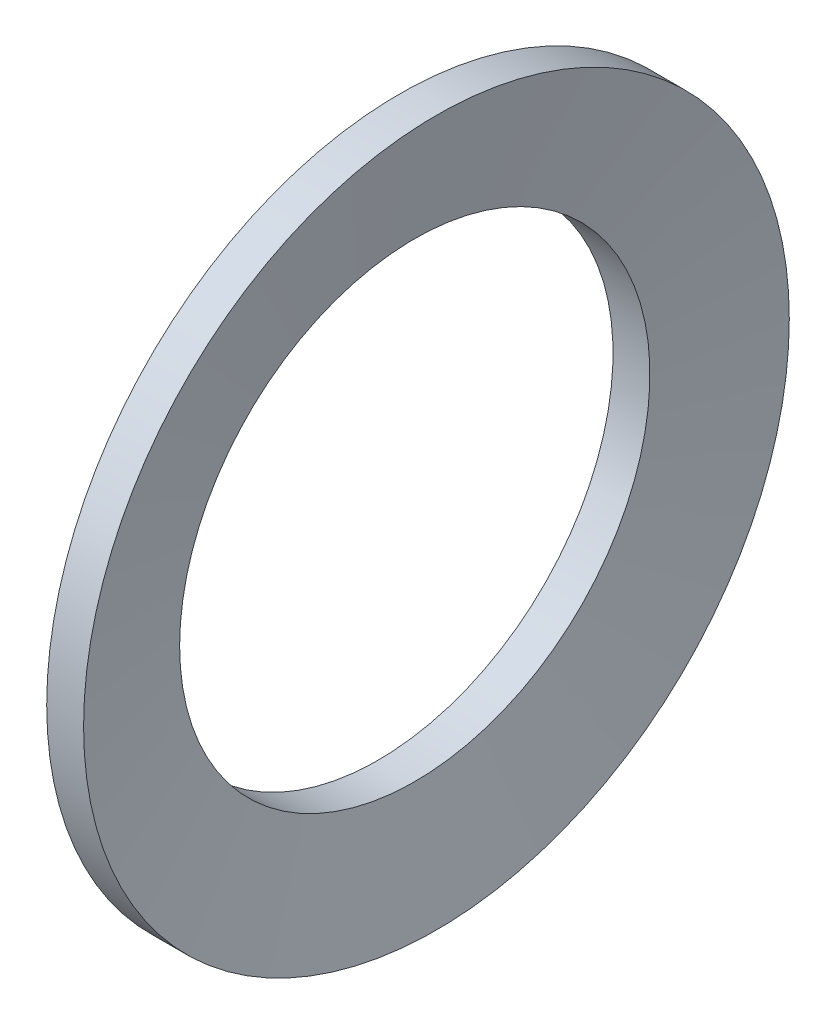
ISO-10303-21;
HEADER;
FILE_DESCRIPTION(('STEP AP214'),'2;1');
FILE_NAME('part.step','',(''),(''),'','','');
FILE_SCHEMA(('AUTOMOTIVE_DESIGN { 1 0 10303 214 1 1 1 1 }'));
ENDSEC;
DATA;
#1=APPLICATION_CONTEXT('core data for automotive mechanical design processes');
#2=APPLICATION_PROTOCOL_DEFINITION('international standard','automotive_design',2000,#1);
#3=PRODUCT_CONTEXT('',#1,'mechanical');
#4=PRODUCT('Part','Part','',(#3));
#5=PRODUCT_RELATED_PRODUCT_CATEGORY('part','',(#4));
#6=PRODUCT_DEFINITION_FORMATION('','',#4);
#7=PRODUCT_DEFINITION_CONTEXT('part definition',#1,'design');
#8=PRODUCT_DEFINITION('design','',#6,#7);
#9=PRODUCT_DEFINITION_SHAPE('','',#8);
#10=(LENGTH_UNIT() NAMED_UNIT(*) SI_UNIT(.MILLI.,.METRE.));
#11=(NAMED_UNIT(*) PLANE_ANGLE_UNIT() SI_UNIT($,.RADIAN.));
#12=(NAMED_UNIT(*) SI_UNIT($,.STERADIAN.) SOLID_ANGLE_UNIT());
#13=UNCERTAINTY_MEASURE_WITH_UNIT(LENGTH_MEASURE(1.E-05),#10,'distance_accuracy_value','');
#14=(GEOMETRIC_REPRESENTATION_CONTEXT(3) GLOBAL_UNCERTAINTY_ASSIGNED_CONTEXT((#13)) GLOBAL_UNIT_ASSIGNED_CONTEXT((#10,
#11,#12)) REPRESENTATION_CONTEXT('',''));
#15=CARTESIAN_POINT('',(0.,0.,0.));
#16=DIRECTION('',(0.,0.,1.));
#17=DIRECTION('',(1.,0.,0.));
#18=AXIS2_PLACEMENT_3D('',#15,#16,#17);
#19=CARTESIAN_POINT('',(0.,0.,0.));
#20=DIRECTION('',(-1.,0.,0.));
#21=DIRECTION('',(0.,0.,1.));
#22=AXIS2_PLACEMENT_3D('',#19,#20,#21);
#23=CYLINDRICAL_SURFACE('',#22,9.9949);
#24=CARTESIAN_POINT('',(-0.921493673034455,0.,0.));
#25=DIRECTION('',(-1.,0.,0.));
#26=DIRECTION('',(0.,0.,1.));
#27=AXIS2_PLACEMENT_3D('',#24,#25,#26);
#28=CIRCLE('',#27,9.9949);
#29=CARTESIAN_POINT('',(-0.921493673034455,0.,9.9949));
#30=VERTEX_POINT('',#29);
#31=EDGE_CURVE('E44',#30,#30,#28,.T.);
#32=ORIENTED_EDGE('',*,*,#31,.F.);
#33=EDGE_LOOP('',(#32));
#34=FACE_BOUND('',#33,.T.);
#35=CARTESIAN_POINT('',(-2.4892,0.,0.));
#36=DIRECTION('',(-1.,0.,0.));
#37=DIRECTION('',(0.,0.,1.));
#38=AXIS2_PLACEMENT_3D('',#35,#36,#37);
#39=CIRCLE('',#38,9.9949);
#40=CARTESIAN_POINT('',(-2.4892,0.,9.9949));
#41=VERTEX_POINT('',#40);
#42=EDGE_CURVE('E10',#41,#41,#39,.T.);
#43=ORIENTED_EDGE('',*,*,#42,.T.);
#44=EDGE_LOOP('',(#43));
#45=FACE_BOUND('',#44,.T.);
#46=ADVANCED_FACE('F30',(#34,#45),#23,.F.);
#47=CARTESIAN_POINT('',(-1.56770632696554,0.,0.));
#48=DIRECTION('',(1.,0.,0.));
#49=DIRECTION('',(0.,0.,-1.));
#50=AXIS2_PLACEMENT_3D('',#47,#48,#49);
#51=CONICAL_SURFACE('',#50,14.9987,1.3886780706567);
#52=ORIENTED_EDGE('',*,*,#42,.F.);
#53=EDGE_LOOP('',(#52));
#54=FACE_BOUND('',#53,.T.);
#55=CARTESIAN_POINT('',(-1.56770632696554,0.,0.));
#56=DIRECTION('',(-1.,0.,0.));
#57=DIRECTION('',(0.,0.,1.));
#58=AXIS2_PLACEMENT_3D('',#55,#56,#57);
#59=CIRCLE('',#58,14.9987);
#60=CARTESIAN_POINT('',(-1.56770632696554,0.,14.9987));
#61=VERTEX_POINT('',#60);
#62=EDGE_CURVE('E36',#61,#61,#59,.T.);
#63=ORIENTED_EDGE('',*,*,#62,.T.);
#64=EDGE_LOOP('',(#63));
#65=FACE_BOUND('',#64,.T.);
#66=ADVANCED_FACE('F53',(#54,#65),#51,.T.);
#67=CARTESIAN_POINT('',(0.,0.,0.));
#68=DIRECTION('',(-1.,0.,0.));
#69=DIRECTION('',(0.,0.,1.));
#70=AXIS2_PLACEMENT_3D('',#67,#68,#69);
#71=CYLINDRICAL_SURFACE('',#70,14.9987);
#72=ORIENTED_EDGE('',*,*,#62,.F.);
#73=EDGE_LOOP('',(#72));
#74=FACE_BOUND('',#73,.T.);
#75=CARTESIAN_POINT('',(0.,0.,0.));
#76=DIRECTION('',(-1.,0.,0.));
#77=DIRECTION('',(0.,0.,1.));
#78=AXIS2_PLACEMENT_3D('',#75,#76,#77);
#79=CIRCLE('',#78,14.9987);
#80=CARTESIAN_POINT('',(0.,0.,14.9987));
#81=VERTEX_POINT('',#80);
#82=EDGE_CURVE('E40',#81,#81,#79,.T.);
#83=ORIENTED_EDGE('',*,*,#82,.T.);
#84=EDGE_LOOP('',(#83));
#85=FACE_BOUND('',#84,.T.);
#86=ADVANCED_FACE('F57',(#74,#85),#71,.T.);
#87=CARTESIAN_POINT('',(-0.921493673034455,0.,0.));
#88=DIRECTION('',(1.,0.,0.));
#89=DIRECTION('',(0.,0.,-1.));
#90=AXIS2_PLACEMENT_3D('',#87,#88,#89);
#91=CONICAL_SURFACE('',#90,9.9949,1.3886780706567);
#92=ORIENTED_EDGE('',*,*,#82,.F.);
#93=EDGE_LOOP('',(#92));
#94=FACE_BOUND('',#93,.T.);
#95=ORIENTED_EDGE('',*,*,#31,.T.);
#96=EDGE_LOOP('',(#95));
#97=FACE_BOUND('',#96,.T.);
#98=ADVANCED_FACE('F50',(#94,#97),#91,.F.);
#99=CLOSED_SHELL('',(#46,#66,#86,#98));
#100=MANIFOLD_SOLID_BREP('B2',#99);
#101=ADVANCED_BREP_SHAPE_REPRESENTATION('',(#18,#100),#14);
#102=SHAPE_DEFINITION_REPRESENTATION(#9,#101);
ENDSEC;
END-ISO-10303-21;
